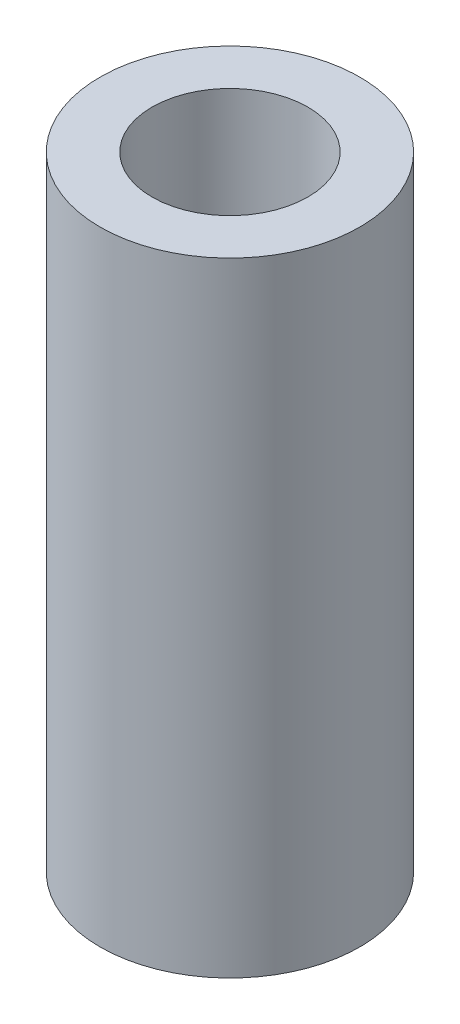
ISO-10303-21;
HEADER;
FILE_DESCRIPTION(('STEP AP214'),'2;1');
FILE_NAME('part.step','',(''),(''),'','','');
FILE_SCHEMA(('AUTOMOTIVE_DESIGN { 1 0 10303 214 1 1 1 1 }'));
ENDSEC;
DATA;
#1=APPLICATION_CONTEXT('core data for automotive mechanical design processes');
#2=APPLICATION_PROTOCOL_DEFINITION('international standard','automotive_design',2000,#1);
#3=PRODUCT_CONTEXT('',#1,'mechanical');
#4=PRODUCT('Part','Part','',(#3));
#5=PRODUCT_RELATED_PRODUCT_CATEGORY('part','',(#4));
#6=PRODUCT_DEFINITION_FORMATION('','',#4);
#7=PRODUCT_DEFINITION_CONTEXT('part definition',#1,'design');
#8=PRODUCT_DEFINITION('design','',#6,#7);
#9=PRODUCT_DEFINITION_SHAPE('','',#8);
#10=(LENGTH_UNIT() NAMED_UNIT(*) SI_UNIT(.MILLI.,.METRE.));
#11=(NAMED_UNIT(*) PLANE_ANGLE_UNIT() SI_UNIT($,.RADIAN.));
#12=(NAMED_UNIT(*) SI_UNIT($,.STERADIAN.) SOLID_ANGLE_UNIT());
#13=UNCERTAINTY_MEASURE_WITH_UNIT(LENGTH_MEASURE(1.E-05),#10,'distance_accuracy_value','');
#14=(GEOMETRIC_REPRESENTATION_CONTEXT(3) GLOBAL_UNCERTAINTY_ASSIGNED_CONTEXT((#13)) GLOBAL_UNIT_ASSIGNED_CONTEXT((#10,
#11,#12)) REPRESENTATION_CONTEXT('',''));
#15=CARTESIAN_POINT('',(0.,0.,0.));
#16=DIRECTION('',(0.,0.,1.));
#17=DIRECTION('',(1.,0.,0.));
#18=AXIS2_PLACEMENT_3D('',#15,#16,#17);
#19=CARTESIAN_POINT('',(0.,120.,0.));
#20=DIRECTION('',(0.,1.,0.));
#21=DIRECTION('',(0.,0.,1.));
#22=AXIS2_PLACEMENT_3D('',#19,#20,#21);
#23=PLANE('',#22);
#24=CARTESIAN_POINT('',(0.,120.,0.));
#25=DIRECTION('',(0.,1.,0.));
#26=DIRECTION('',(0.,0.,1.));
#27=AXIS2_PLACEMENT_3D('',#24,#25,#26);
#28=CIRCLE('',#27,25.);
#29=CARTESIAN_POINT('',(0.,120.,25.));
#30=VERTEX_POINT('',#29);
#31=EDGE_CURVE('E10',#30,#30,#28,.T.);
#32=ORIENTED_EDGE('',*,*,#31,.T.);
#33=EDGE_LOOP('',(#32));
#34=FACE_BOUND('',#33,.T.);
#35=CARTESIAN_POINT('',(0.,120.,0.));
#36=DIRECTION('',(0.,1.,0.));
#37=DIRECTION('',(0.,0.,1.));
#38=AXIS2_PLACEMENT_3D('',#35,#36,#37);
#39=CIRCLE('',#38,15.);
#40=CARTESIAN_POINT('',(0.,120.,15.));
#41=VERTEX_POINT('',#40);
#42=EDGE_CURVE('E48',#41,#41,#39,.T.);
#43=ORIENTED_EDGE('',*,*,#42,.F.);
#44=EDGE_LOOP('',(#43));
#45=FACE_BOUND('',#44,.T.);
#46=ADVANCED_FACE('F40',(#34,#45),#23,.T.);
#47=CARTESIAN_POINT('',(0.,0.,0.));
#48=DIRECTION('',(0.,1.,0.));
#49=DIRECTION('',(0.,0.,1.));
#50=AXIS2_PLACEMENT_3D('',#47,#48,#49);
#51=PLANE('',#50);
#52=CARTESIAN_POINT('',(0.,0.,0.));
#53=DIRECTION('',(0.,1.,0.));
#54=DIRECTION('',(0.,0.,1.));
#55=AXIS2_PLACEMENT_3D('',#52,#53,#54);
#56=CIRCLE('',#55,25.);
#57=CARTESIAN_POINT('',(0.,0.,25.));
#58=VERTEX_POINT('',#57);
#59=EDGE_CURVE('E41',#58,#58,#56,.T.);
#60=ORIENTED_EDGE('',*,*,#59,.F.);
#61=EDGE_LOOP('',(#60));
#62=FACE_BOUND('',#61,.T.);
#63=CARTESIAN_POINT('',(0.,0.,0.));
#64=DIRECTION('',(0.,1.,0.));
#65=DIRECTION('',(0.,0.,1.));
#66=AXIS2_PLACEMENT_3D('',#63,#64,#65);
#67=CIRCLE('',#66,15.);
#68=CARTESIAN_POINT('',(0.,0.,15.));
#69=VERTEX_POINT('',#68);
#70=EDGE_CURVE('E49',#69,#69,#67,.T.);
#71=ORIENTED_EDGE('',*,*,#70,.T.);
#72=EDGE_LOOP('',(#71));
#73=FACE_BOUND('',#72,.T.);
#74=ADVANCED_FACE('F58',(#62,#73),#51,.F.);
#75=CARTESIAN_POINT('',(0.,120.,0.));
#76=DIRECTION('',(0.,-1.,0.));
#77=DIRECTION('',(0.,0.,-1.));
#78=AXIS2_PLACEMENT_3D('',#75,#76,#77);
#79=CYLINDRICAL_SURFACE('',#78,25.);
#80=ORIENTED_EDGE('',*,*,#31,.F.);
#81=EDGE_LOOP('',(#80));
#82=FACE_BOUND('',#81,.T.);
#83=ORIENTED_EDGE('',*,*,#59,.T.);
#84=EDGE_LOOP('',(#83));
#85=FACE_BOUND('',#84,.T.);
#86=ADVANCED_FACE('F39',(#82,#85),#79,.T.);
#87=CARTESIAN_POINT('',(0.,120.,0.));
#88=DIRECTION('',(0.,-1.,0.));
#89=DIRECTION('',(0.,0.,-1.));
#90=AXIS2_PLACEMENT_3D('',#87,#88,#89);
#91=CYLINDRICAL_SURFACE('',#90,15.);
#92=ORIENTED_EDGE('',*,*,#42,.T.);
#93=EDGE_LOOP('',(#92));
#94=FACE_BOUND('',#93,.T.);
#95=ORIENTED_EDGE('',*,*,#70,.F.);
#96=EDGE_LOOP('',(#95));
#97=FACE_BOUND('',#96,.T.);
#98=ADVANCED_FACE('F57',(#94,#97),#91,.F.);
#99=CLOSED_SHELL('',(#46,#74,#86,#98));
#100=MANIFOLD_SOLID_BREP('B2',#99);
#101=ADVANCED_BREP_SHAPE_REPRESENTATION('',(#18,#100),#14);
#102=SHAPE_DEFINITION_REPRESENTATION(#9,#101);
ENDSEC;
END-ISO-10303-21;
